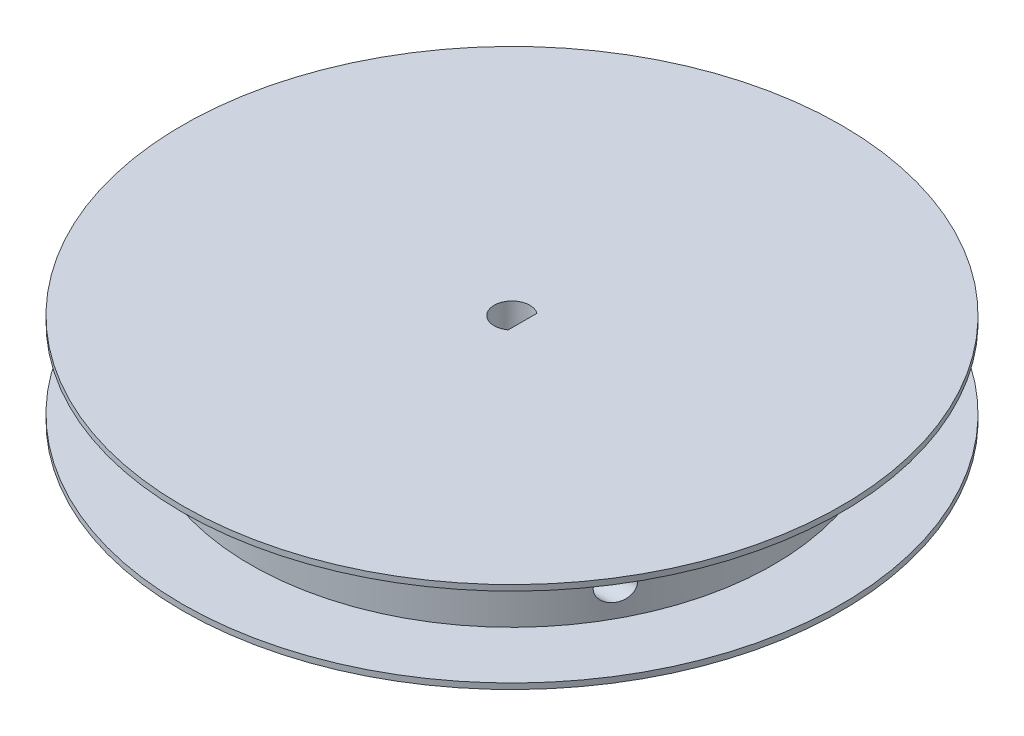
ISO-10303-21;
HEADER;
FILE_DESCRIPTION(('STEP AP214'),'2;1');
FILE_NAME('part.step','',(''),(''),'','','');
FILE_SCHEMA(('AUTOMOTIVE_DESIGN { 1 0 10303 214 1 1 1 1 }'));
ENDSEC;
DATA;
#1=APPLICATION_CONTEXT('core data for automotive mechanical design processes');
#2=APPLICATION_PROTOCOL_DEFINITION('international standard','automotive_design',2000,#1);
#3=PRODUCT_CONTEXT('',#1,'mechanical');
#4=PRODUCT('Part','Part','',(#3));
#5=PRODUCT_RELATED_PRODUCT_CATEGORY('part','',(#4));
#6=PRODUCT_DEFINITION_FORMATION('','',#4);
#7=PRODUCT_DEFINITION_CONTEXT('part definition',#1,'design');
#8=PRODUCT_DEFINITION('design','',#6,#7);
#9=PRODUCT_DEFINITION_SHAPE('','',#8);
#10=(LENGTH_UNIT() NAMED_UNIT(*) SI_UNIT(.MILLI.,.METRE.));
#11=(NAMED_UNIT(*) PLANE_ANGLE_UNIT() SI_UNIT($,.RADIAN.));
#12=(NAMED_UNIT(*) SI_UNIT($,.STERADIAN.) SOLID_ANGLE_UNIT());
#13=UNCERTAINTY_MEASURE_WITH_UNIT(LENGTH_MEASURE(1.E-05),#10,'distance_accuracy_value','');
#14=(GEOMETRIC_REPRESENTATION_CONTEXT(3) GLOBAL_UNCERTAINTY_ASSIGNED_CONTEXT((#13)) GLOBAL_UNIT_ASSIGNED_CONTEXT((#10,
#11,#12)) REPRESENTATION_CONTEXT('',''));
#15=CARTESIAN_POINT('',(0.,0.,0.));
#16=DIRECTION('',(0.,0.,1.));
#17=DIRECTION('',(1.,0.,0.));
#18=AXIS2_PLACEMENT_3D('',#15,#16,#17);
#19=CARTESIAN_POINT('',(0.,0.,0.));
#20=DIRECTION('',(0.,-1.,0.));
#21=DIRECTION('',(0.,0.,-1.));
#22=AXIS2_PLACEMENT_3D('',#19,#20,#21);
#23=CYLINDRICAL_SURFACE('',#22,23.);
#24=CARTESIAN_POINT('',(-20.8201277665788,-4.98760134399845,9.77355000925123));
#25=CARTESIAN_POINT('',(-20.8201267400689,-5.05328921218362,9.77355269440811));
#26=CARTESIAN_POINT('',(-20.8177072873382,-5.11900916263321,9.77871135535889));
#27=CARTESIAN_POINT('',(-20.8081066599204,-5.24853422398031,9.79912338930162));
#28=CARTESIAN_POINT('',(-20.8009215578614,-5.31233771015021,9.81438508818777));
#29=CARTESIAN_POINT('',(-20.7820462072199,-5.43607376462551,9.85429030868141));
#30=CARTESIAN_POINT('',(-20.7703653214766,-5.49601407742824,9.87891433119441));
#31=CARTESIAN_POINT('',(-20.7428608743051,-5.61066285216219,9.93653546990273));
#32=CARTESIAN_POINT('',(-20.727037405656,-5.66537143122823,9.96953239857416));
#33=CARTESIAN_POINT('',(-20.691075857807,-5.77020444373711,10.0439604326227));
#34=CARTESIAN_POINT('',(-20.670806961056,-5.82010353323316,10.0856447657695));
#35=CARTESIAN_POINT('',(-20.6268496625276,-5.91218896571839,10.1752426136738));
#36=CARTESIAN_POINT('',(-20.6031602205385,-5.95437295361405,10.2231580229028));
#37=CARTESIAN_POINT('',(-20.5506658867992,-6.03388388818919,10.3283047158286));
#38=CARTESIAN_POINT('',(-20.52159288954,-6.07043778380417,10.3859859821205));
#39=CARTESIAN_POINT('',(-20.4607576235509,-6.13338225985286,10.5053267202189));
#40=CARTESIAN_POINT('',(-20.4289941897235,-6.15976840939713,10.5669879127591));
#41=CARTESIAN_POINT('',(-20.3599903962203,-6.20452845800528,10.6993890838998));
#42=CARTESIAN_POINT('',(-20.3225261660952,-6.22175886866498,10.7703992577655));
#43=CARTESIAN_POINT('',(-20.2460397640869,-6.24375841948167,10.9134993395186));
#44=CARTESIAN_POINT('',(-20.2070169535579,-6.24852239707175,10.9855896822982));
#45=CARTESIAN_POINT('',(-20.1247250962086,-6.24565444294804,11.1356814442102));
#46=CARTESIAN_POINT('',(-20.0813914932744,-6.23686109082303,11.2136270695252));
#47=CARTESIAN_POINT('',(-19.9950876873888,-6.20496065912906,11.3668028753028));
#48=CARTESIAN_POINT('',(-19.9521177256557,-6.1818447340537,11.4420313472649));
#49=CARTESIAN_POINT('',(-19.8665341245799,-6.12063328970248,11.5900109354408));
#50=CARTESIAN_POINT('',(-19.8239747139013,-6.0820872304539,11.662608503972));
#51=CARTESIAN_POINT('',(-19.7423744709691,-5.99047026825072,11.8002134107429));
#52=CARTESIAN_POINT('',(-19.7033297089548,-5.93741586222082,11.8652292508431));
#53=CARTESIAN_POINT('',(-19.6387129089711,-5.83063358399123,11.9717987607318));
#54=CARTESIAN_POINT('',(-19.6120594250459,-5.779574184091,12.0153773094841));
#55=CARTESIAN_POINT('',(-19.5632844313971,-5.66970305555947,12.094629611591));
#56=CARTESIAN_POINT('',(-19.5411605284595,-5.610895447846,12.1303075400725));
#57=CARTESIAN_POINT('',(-19.5025309991407,-5.48625979543512,12.1923188001952));
#58=CARTESIAN_POINT('',(-19.48606438857,-5.42038695338582,12.2185872900309));
#59=CARTESIAN_POINT('',(-19.460138165894,-5.2838896706092,12.2598380408782));
#60=CARTESIAN_POINT('',(-19.4506727922263,-5.21326918921244,12.2748295822578));
#61=CARTESIAN_POINT('',(-19.4401949951983,-5.07865009153111,12.2914156617952));
#62=CARTESIAN_POINT('',(-19.4382943496703,-5.01489101173985,12.2944180837121));
#63=CARTESIAN_POINT('',(-19.4406119502735,-4.88777579606356,12.2907531575771));
#64=CARTESIAN_POINT('',(-19.4448281927299,-4.82441953505639,12.2840889759608));
#65=CARTESIAN_POINT('',(-19.458694418242,-4.70350942743787,12.2621109286092));
#66=CARTESIAN_POINT('',(-19.4680336272977,-4.64582793661162,12.247291624817));
#67=CARTESIAN_POINT('',(-19.4913930540478,-4.53397904493975,12.2100809377849));
#68=CARTESIAN_POINT('',(-19.5054140065392,-4.47981219731026,12.1876883659176));
#69=CARTESIAN_POINT('',(-19.5384236708607,-4.37296117317289,12.1347034190032));
#70=CARTESIAN_POINT('',(-19.5576582997464,-4.32055691502562,12.1037024761793));
#71=CARTESIAN_POINT('',(-19.5997880562224,-4.22170986421361,12.035361194132));
#72=CARTESIAN_POINT('',(-19.6226847925312,-4.17526970774501,11.9980180684179));
#73=CARTESIAN_POINT('',(-19.6745416218283,-4.08317980812586,11.912816971982));
#74=CARTESIAN_POINT('',(-19.7039031159814,-4.03843906271518,11.864221939886));
#75=CARTESIAN_POINT('',(-19.7652499030421,-3.95768561395183,11.7617375108293));
#76=CARTESIAN_POINT('',(-19.7972366251352,-3.92167770754775,11.707845226824));
#77=CARTESIAN_POINT('',(-19.8677115944034,-3.85407285703309,11.5879047669792));
#78=CARTESIAN_POINT('',(-19.9064702174051,-3.82387162853427,11.5212268524579));
#79=CARTESIAN_POINT('',(-19.9851165584924,-3.77550739333209,11.3842594884077));
#80=CARTESIAN_POINT('',(-20.0250048590958,-3.75735071974017,11.3139681598157));
#81=CARTESIAN_POINT('',(-20.1088059569422,-3.73215078617892,11.1644056707805));
#82=CARTESIAN_POINT('',(-20.1527320638943,-3.72636325854476,11.0849270458703));
#83=CARTESIAN_POINT('',(-20.2395075501056,-3.72990510680774,10.925683553727));
#84=CARTESIAN_POINT('',(-20.2823566640972,-3.73923817062283,10.8459186213981));
#85=CARTESIAN_POINT('',(-20.3661340263243,-3.77341967969418,10.6877806683589));
#86=CARTESIAN_POINT('',(-20.4070426646146,-3.79840041252969,10.6094254357774));
#87=CARTESIAN_POINT('',(-20.4852622063449,-3.86403357945955,10.4575962413583));
#88=CARTESIAN_POINT('',(-20.5225746060667,-3.90467946028357,10.3841202534126));
#89=CARTESIAN_POINT('',(-20.5896112388732,-3.99747554616025,10.2505158653664));
#90=CARTESIAN_POINT('',(-20.6196974234072,-4.04850951140107,10.1897965786492));
#91=CARTESIAN_POINT('',(-20.6745904664933,-4.16257559992489,10.0779558291294));
#92=CARTESIAN_POINT('',(-20.6994009681721,-4.2255993862733,10.0268277460066));
#93=CARTESIAN_POINT('',(-20.7402335468622,-4.35402369954427,9.94206607720204));
#94=CARTESIAN_POINT('',(-20.7569356645602,-4.41833101838886,9.90710146572944));
#95=CARTESIAN_POINT('',(-20.7847494093795,-4.5530143041613,9.84861672640362));
#96=CARTESIAN_POINT('',(-20.7958706122539,-4.62337963194415,9.8250769979918));
#97=CARTESIAN_POINT('',(-20.8093323547087,-4.74314940688926,9.79652169523021));
#98=CARTESIAN_POINT('',(-20.8133728144627,-4.791543986184,9.78792888269836));
#99=CARTESIAN_POINT('',(-20.8187707618184,-4.88915354306745,9.77644233776328));
#100=CARTESIAN_POINT('',(-20.8201285359457,-4.93836843247624,9.77354799673211));
#101=CARTESIAN_POINT('',(-20.8201277665788,-4.98760134399845,9.77355000925123));
#102=B_SPLINE_CURVE_WITH_KNOTS('',3,(#24,#25,#26,#27,#28,#29,#30,#31,#32,#33,#34,#35,#36,#37,
#38,#39,#40,#41,#42,#43,#44,#45,#46,#47,#48,#49,#50,#51,#52,#53,#54,#55,#56,#57,#58,#59,#60,#61,
#62,#63,#64,#65,#66,#67,#68,#69,#70,#71,#72,#73,#74,#75,#76,#77,#78,#79,#80,#81,#82,#83,#84,#85,
#86,#87,#88,#89,#90,#91,#92,#93,#94,#95,#96,#97,#98,#99,#100,#101),.UNSPECIFIED.,.T.,.F.,(4,2,2,
2,2,2,2,2,2,2,2,2,2,2,2,2,2,2,2,2,2,2,2,2,2,2,2,2,2,2,2,2,2,2,2,2,2,2,4),(0.,0.196876778612762,
0.393916005316138,0.590547082804578,0.787173756831328,0.990632758969205,1.19415376523176,
1.41589714377441,1.63773704442347,1.88305470803927,2.12847394590394,2.39611422115121,
2.66391995387426,2.94019364581868,3.21615449369814,3.43195240973539,3.64763601255944,
3.86477855692607,4.08174220768487,4.27231236434436,4.46282011109236,4.64287693548719,
4.82296203299418,5.0137607229395,5.20464345977375,5.42065667022378,5.63678826934365,
5.88424526795129,6.13183227826827,6.4035518011501,6.67533760650369,6.94945272641147,
7.22345329878588,7.47651928301109,7.72940994069358,7.95342273551865,8.17704984286561,
8.32462431441878,8.47218302335565),.UNSPECIFIED.);
#103=CARTESIAN_POINT('',(-20.8201277665788,-4.98760134399845,9.77355000925123));
#104=VERTEX_POINT('',#103);
#105=EDGE_CURVE('E46',#104,#104,#102,.T.);
#106=ORIENTED_EDGE('',*,*,#105,.F.);
#107=EDGE_LOOP('',(#106));
#108=FACE_BOUND('',#107,.T.);
#109=CARTESIAN_POINT('',(20.8201277665788,-4.98760134399845,9.77355000925123));
#110=CARTESIAN_POINT('',(20.8201267400689,-4.92191347581328,9.77355269440811));
#111=CARTESIAN_POINT('',(20.8177072873382,-4.85619352536369,9.77871135535889));
#112=CARTESIAN_POINT('',(20.8081066599204,-4.72666846401659,9.79912338930162));
#113=CARTESIAN_POINT('',(20.8009215578614,-4.66286497784669,9.81438508818777));
#114=CARTESIAN_POINT('',(20.7820462072199,-4.53912892337139,9.85429030868141));
#115=CARTESIAN_POINT('',(20.7703653214766,-4.47918861056866,9.87891433119441));
#116=CARTESIAN_POINT('',(20.7428608743051,-4.36453983583471,9.93653546990273));
#117=CARTESIAN_POINT('',(20.727037405656,-4.30983125676867,9.96953239857416));
#118=CARTESIAN_POINT('',(20.691075857807,-4.20499824425979,10.0439604326227));
#119=CARTESIAN_POINT('',(20.670806961056,-4.15509915476373,10.0856447657695));
#120=CARTESIAN_POINT('',(20.6268496625276,-4.06301372227851,10.1752426136738));
#121=CARTESIAN_POINT('',(20.6031602205385,-4.02082973438285,10.2231580229028));
#122=CARTESIAN_POINT('',(20.5506658867992,-3.94131879980771,10.3283047158286));
#123=CARTESIAN_POINT('',(20.52159288954,-3.90476490419273,10.3859859821205));
#124=CARTESIAN_POINT('',(20.4607576235509,-3.84182042814404,10.5053267202189));
#125=CARTESIAN_POINT('',(20.4289941897235,-3.81543427859977,10.5669879127591));
#126=CARTESIAN_POINT('',(20.3599903962203,-3.77067422999162,10.6993890838998));
#127=CARTESIAN_POINT('',(20.3225261660952,-3.75344381933192,10.7703992577655));
#128=CARTESIAN_POINT('',(20.2460397640869,-3.73144426851523,10.9134993395186));
#129=CARTESIAN_POINT('',(20.2070169535579,-3.72668029092514,10.9855896822982));
#130=CARTESIAN_POINT('',(20.1247250962086,-3.72954824504886,11.1356814442102));
#131=CARTESIAN_POINT('',(20.0813914932744,-3.73834159717387,11.2136270695252));
#132=CARTESIAN_POINT('',(19.9950876873888,-3.77024202886784,11.3668028753028));
#133=CARTESIAN_POINT('',(19.9521177256557,-3.7933579539432,11.4420313472649));
#134=CARTESIAN_POINT('',(19.8665341245799,-3.85456939829442,11.5900109354408));
#135=CARTESIAN_POINT('',(19.8239747139013,-3.893115457543,11.662608503972));
#136=CARTESIAN_POINT('',(19.7423744709691,-3.98473241974617,11.8002134107429));
#137=CARTESIAN_POINT('',(19.7033297089548,-4.03778682577607,11.8652292508431));
#138=CARTESIAN_POINT('',(19.6387129089711,-4.14456910400567,11.9717987607318));
#139=CARTESIAN_POINT('',(19.6120594250459,-4.1956285039059,12.0153773094841));
#140=CARTESIAN_POINT('',(19.5632844313971,-4.30549963243742,12.094629611591));
#141=CARTESIAN_POINT('',(19.5411605284595,-4.3643072401509,12.1303075400725));
#142=CARTESIAN_POINT('',(19.5025309991407,-4.48894289256178,12.1923188001952));
#143=CARTESIAN_POINT('',(19.48606438857,-4.55481573461108,12.2185872900309));
#144=CARTESIAN_POINT('',(19.460138165894,-4.69131301738769,12.2598380408782));
#145=CARTESIAN_POINT('',(19.4506727922263,-4.76193349878446,12.2748295822578));
#146=CARTESIAN_POINT('',(19.4401949951983,-4.89655259646579,12.2914156617952));
#147=CARTESIAN_POINT('',(19.4382943496703,-4.96031167625705,12.2944180837121));
#148=CARTESIAN_POINT('',(19.4406119502735,-5.08742689193334,12.2907531575771));
#149=CARTESIAN_POINT('',(19.4448281927299,-5.15078315294051,12.2840889759608));
#150=CARTESIAN_POINT('',(19.458694418242,-5.27169326055902,12.2621109286092));
#151=CARTESIAN_POINT('',(19.4680336272977,-5.32937475138528,12.247291624817));
#152=CARTESIAN_POINT('',(19.4913930540478,-5.44122364305715,12.2100809377849));
#153=CARTESIAN_POINT('',(19.5054140065392,-5.49539049068663,12.1876883659176));
#154=CARTESIAN_POINT('',(19.5384236708607,-5.60224151482401,12.1347034190032));
#155=CARTESIAN_POINT('',(19.5576582997464,-5.65464577297128,12.1037024761793));
#156=CARTESIAN_POINT('',(19.5997880562224,-5.75349282378329,12.035361194132));
#157=CARTESIAN_POINT('',(19.6226847925312,-5.79993298025188,11.9980180684179));
#158=CARTESIAN_POINT('',(19.6745416218283,-5.89202287987104,11.912816971982));
#159=CARTESIAN_POINT('',(19.7039031159814,-5.93676362528172,11.864221939886));
#160=CARTESIAN_POINT('',(19.7652499030421,-6.01751707404507,11.7617375108293));
#161=CARTESIAN_POINT('',(19.7972366251352,-6.05352498044915,11.707845226824));
#162=CARTESIAN_POINT('',(19.8677115944034,-6.12112983096381,11.5879047669792));
#163=CARTESIAN_POINT('',(19.9064702174051,-6.15133105946263,11.5212268524579));
#164=CARTESIAN_POINT('',(19.9851165584924,-6.19969529466481,11.3842594884077));
#165=CARTESIAN_POINT('',(20.0250048590958,-6.21785196825672,11.3139681598157));
#166=CARTESIAN_POINT('',(20.1088059569422,-6.24305190181798,11.1644056707805));
#167=CARTESIAN_POINT('',(20.1527320638943,-6.24883942945213,11.0849270458703));
#168=CARTESIAN_POINT('',(20.2395075501056,-6.24529758118916,10.925683553727));
#169=CARTESIAN_POINT('',(20.2823566640972,-6.23596451737407,10.8459186213981));
#170=CARTESIAN_POINT('',(20.3661340263243,-6.20178300830271,10.6877806683589));
#171=CARTESIAN_POINT('',(20.4070426646146,-6.1768022754672,10.6094254357774));
#172=CARTESIAN_POINT('',(20.4852622063449,-6.11116910853735,10.4575962413583));
#173=CARTESIAN_POINT('',(20.5225746060667,-6.07052322771333,10.3841202534126));
#174=CARTESIAN_POINT('',(20.5896112388732,-5.97772714183664,10.2505158653664));
#175=CARTESIAN_POINT('',(20.6196974234072,-5.92669317659583,10.1897965786492));
#176=CARTESIAN_POINT('',(20.6745904664933,-5.81262708807201,10.0779558291294));
#177=CARTESIAN_POINT('',(20.6994009681721,-5.74960330172359,10.0268277460066));
#178=CARTESIAN_POINT('',(20.7402335468622,-5.62117898845263,9.94206607720204));
#179=CARTESIAN_POINT('',(20.7569356645602,-5.55687166960804,9.90710146572944));
#180=CARTESIAN_POINT('',(20.7847494093795,-5.4221883838356,9.84861672640362));
#181=CARTESIAN_POINT('',(20.7958706122539,-5.35182305605274,9.8250769979918));
#182=CARTESIAN_POINT('',(20.8093323547087,-5.23205328110764,9.79652169523021));
#183=CARTESIAN_POINT('',(20.8133728144627,-5.1836587018129,9.78792888269836));
#184=CARTESIAN_POINT('',(20.8187707618184,-5.08604914492945,9.77644233776328));
#185=CARTESIAN_POINT('',(20.8201285359457,-5.03683425552065,9.77354799673211));
#186=CARTESIAN_POINT('',(20.8201277665788,-4.98760134399845,9.77355000925123));
#187=B_SPLINE_CURVE_WITH_KNOTS('',3,(#109,#110,#111,#112,#113,#114,#115,#116,#117,#118,#119,
#120,#121,#122,#123,#124,#125,#126,#127,#128,#129,#130,#131,#132,#133,#134,#135,#136,#137,#138,
#139,#140,#141,#142,#143,#144,#145,#146,#147,#148,#149,#150,#151,#152,#153,#154,#155,#156,#157,
#158,#159,#160,#161,#162,#163,#164,#165,#166,#167,#168,#169,#170,#171,#172,#173,#174,#175,#176,
#177,#178,#179,#180,#181,#182,#183,#184,#185,#186),.UNSPECIFIED.,.T.,.F.,(4,2,2,2,2,2,2,2,2,2,2,
2,2,2,2,2,2,2,2,2,2,2,2,2,2,2,2,2,2,2,2,2,2,2,2,2,2,2,4),(0.,0.196876778612762,
0.393916005316138,0.590547082804579,0.787173756831328,0.990632758969206,1.19415376523176,
1.41589714377441,1.63773704442347,1.88305470803927,2.12847394590394,2.39611422115121,
2.66391995387426,2.94019364581868,3.21615449369814,3.43195240973539,3.64763601255944,
3.86477855692607,4.08174220768487,4.27231236434437,4.46282011109236,4.64287693548719,
4.82296203299419,5.0137607229395,5.20464345977376,5.42065667022378,5.63678826934365,
5.88424526795129,6.13183227826827,6.4035518011501,6.67533760650369,6.94945272641147,
7.22345329878589,7.47651928301109,7.72940994069358,7.95342273551865,8.17704984286561,
8.32462431441878,8.47218302335565),.UNSPECIFIED.);
#188=CARTESIAN_POINT('',(20.8201277665788,-4.98760134399845,9.77355000925123));
#189=VERTEX_POINT('',#188);
#190=EDGE_CURVE('E94',#189,#189,#187,.T.);
#191=ORIENTED_EDGE('',*,*,#190,.F.);
#192=EDGE_LOOP('',(#191));
#193=FACE_BOUND('',#192,.T.);
#194=CARTESIAN_POINT('',(0.,-0.5,0.));
#195=DIRECTION('',(0.,1.,0.));
#196=DIRECTION('',(0.,0.,1.));
#197=AXIS2_PLACEMENT_3D('',#194,#195,#196);
#198=CIRCLE('',#197,23.);
#199=CARTESIAN_POINT('',(0.,-0.5,23.));
#200=VERTEX_POINT('',#199);
#201=EDGE_CURVE('E139',#200,#200,#198,.T.);
#202=ORIENTED_EDGE('',*,*,#201,.F.);
#203=EDGE_LOOP('',(#202));
#204=FACE_BOUND('',#203,.T.);
#205=CARTESIAN_POINT('',(0.,-7.5,0.));
#206=DIRECTION('',(0.,-1.,0.));
#207=DIRECTION('',(0.,0.,-1.));
#208=AXIS2_PLACEMENT_3D('',#205,#206,#207);
#209=CIRCLE('',#208,23.);
#210=CARTESIAN_POINT('',(0.,-7.5,-23.));
#211=VERTEX_POINT('',#210);
#212=EDGE_CURVE('E142',#211,#211,#209,.T.);
#213=ORIENTED_EDGE('',*,*,#212,.F.);
#214=EDGE_LOOP('',(#213));
#215=FACE_BOUND('',#214,.T.);
#216=ADVANCED_FACE('F42',(#108,#193,#204,#215),#23,.T.);
#217=CARTESIAN_POINT('',(0.,-8.,0.));
#218=DIRECTION('',(0.,1.,0.));
#219=DIRECTION('',(0.,0.,1.));
#220=AXIS2_PLACEMENT_3D('',#217,#218,#219);
#221=PLANE('',#220);
#222=DIRECTION('',(0.,0.,-1.));
#223=VECTOR('',#222,1.);
#224=CARTESIAN_POINT('',(0.93,-8.,0.));
#225=LINE('',#224,#223);
#226=CARTESIAN_POINT('',(0.93,-8.,1.26491106406735));
#227=VERTEX_POINT('',#226);
#228=CARTESIAN_POINT('',(0.93,-8.,-1.26491106406735));
#229=VERTEX_POINT('',#228);
#230=EDGE_CURVE('E63',#227,#229,#225,.T.);
#231=ORIENTED_EDGE('',*,*,#230,.T.);
#232=CARTESIAN_POINT('',(0.,-8.,0.));
#233=DIRECTION('',(0.,-1.,0.));
#234=DIRECTION('',(0.,0.,-1.));
#235=AXIS2_PLACEMENT_3D('',#232,#233,#234);
#236=CIRCLE('',#235,1.57);
#237=EDGE_CURVE('E79',#227,#229,#236,.T.);
#238=ORIENTED_EDGE('',*,*,#237,.F.);
#239=EDGE_LOOP('',(#231,#238));
#240=FACE_BOUND('',#239,.T.);
#241=CARTESIAN_POINT('',(0.,-8.,0.));
#242=DIRECTION('',(0.,-1.,0.));
#243=DIRECTION('',(0.,0.,-1.));
#244=AXIS2_PLACEMENT_3D('',#241,#242,#243);
#245=CIRCLE('',#244,29.);
#246=CARTESIAN_POINT('',(0.,-8.,-29.));
#247=VERTEX_POINT('',#246);
#248=EDGE_CURVE('E143',#247,#247,#245,.T.);
#249=ORIENTED_EDGE('',*,*,#248,.T.);
#250=EDGE_LOOP('',(#249));
#251=FACE_BOUND('',#250,.T.);
#252=ADVANCED_FACE('F83',(#240,#251),#221,.F.);
#253=CARTESIAN_POINT('',(0.,0.,0.));
#254=DIRECTION('',(0.,1.,0.));
#255=DIRECTION('',(0.,0.,1.));
#256=AXIS2_PLACEMENT_3D('',#253,#254,#255);
#257=PLANE('',#256);
#258=CARTESIAN_POINT('',(0.,0.,0.));
#259=DIRECTION('',(0.,-1.,0.));
#260=DIRECTION('',(0.,0.,-1.));
#261=AXIS2_PLACEMENT_3D('',#258,#259,#260);
#262=CIRCLE('',#261,1.57);
#263=CARTESIAN_POINT('',(0.93,0.,1.26491106406735));
#264=VERTEX_POINT('',#263);
#265=CARTESIAN_POINT('',(0.93,0.,-1.26491106406735));
#266=VERTEX_POINT('',#265);
#267=EDGE_CURVE('E91',#264,#266,#262,.T.);
#268=ORIENTED_EDGE('',*,*,#267,.T.);
#269=DIRECTION('',(0.,0.,-1.));
#270=VECTOR('',#269,1.);
#271=CARTESIAN_POINT('',(0.93,0.,0.));
#272=LINE('',#271,#270);
#273=EDGE_CURVE('E76',#264,#266,#272,.T.);
#274=ORIENTED_EDGE('',*,*,#273,.F.);
#275=EDGE_LOOP('',(#268,#274));
#276=FACE_BOUND('',#275,.T.);
#277=CARTESIAN_POINT('',(0.,0.,0.));
#278=DIRECTION('',(0.,1.,0.));
#279=DIRECTION('',(0.,0.,1.));
#280=AXIS2_PLACEMENT_3D('',#277,#278,#279);
#281=CIRCLE('',#280,29.);
#282=CARTESIAN_POINT('',(0.,0.,29.));
#283=VERTEX_POINT('',#282);
#284=EDGE_CURVE('E88',#283,#283,#281,.T.);
#285=ORIENTED_EDGE('',*,*,#284,.T.);
#286=EDGE_LOOP('',(#285));
#287=FACE_BOUND('',#286,.T.);
#288=ADVANCED_FACE('F44',(#276,#287),#257,.T.);
#289=CARTESIAN_POINT('',(0.93,0.,0.));
#290=DIRECTION('',(-1.,0.,0.));
#291=DIRECTION('',(0.,0.,1.));
#292=AXIS2_PLACEMENT_3D('',#289,#290,#291);
#293=PLANE('',#292);
#294=ORIENTED_EDGE('',*,*,#230,.F.);
#295=DIRECTION('',(0.,-1.,0.));
#296=VECTOR('',#295,1.);
#297=CARTESIAN_POINT('',(0.93,0.,1.26491106406735));
#298=LINE('',#297,#296);
#299=EDGE_CURVE('E56',#264,#227,#298,.T.);
#300=ORIENTED_EDGE('',*,*,#299,.F.);
#301=ORIENTED_EDGE('',*,*,#273,.T.);
#302=DIRECTION('',(0.,-1.,0.));
#303=VECTOR('',#302,1.);
#304=CARTESIAN_POINT('',(0.93,0.,-1.26491106406735));
#305=LINE('',#304,#303);
#306=EDGE_CURVE('E11',#266,#229,#305,.T.);
#307=ORIENTED_EDGE('',*,*,#306,.T.);
#308=EDGE_LOOP('',(#294,#300,#301,#307));
#309=FACE_BOUND('',#308,.T.);
#310=ADVANCED_FACE('F74',(#309),#293,.T.);
#311=CARTESIAN_POINT('',(0.,0.,0.));
#312=DIRECTION('',(0.,-1.,0.));
#313=DIRECTION('',(0.,0.,-1.));
#314=AXIS2_PLACEMENT_3D('',#311,#312,#313);
#315=CYLINDRICAL_SURFACE('',#314,1.57);
#316=ORIENTED_EDGE('',*,*,#237,.T.);
#317=ORIENTED_EDGE('',*,*,#306,.F.);
#318=ORIENTED_EDGE('',*,*,#267,.F.);
#319=ORIENTED_EDGE('',*,*,#299,.T.);
#320=EDGE_LOOP('',(#316,#317,#318,#319));
#321=FACE_BOUND('',#320,.T.);
#322=ADVANCED_FACE('F80',(#321),#315,.F.);
#323=CARTESIAN_POINT('',(0.,-0.5,0.));
#324=DIRECTION('',(0.,1.,0.));
#325=DIRECTION('',(0.,0.,1.));
#326=AXIS2_PLACEMENT_3D('',#323,#324,#325);
#327=CYLINDRICAL_SURFACE('',#326,29.);
#328=CARTESIAN_POINT('',(0.,-0.5,0.));
#329=DIRECTION('',(0.,1.,0.));
#330=DIRECTION('',(0.,0.,1.));
#331=AXIS2_PLACEMENT_3D('',#328,#329,#330);
#332=CIRCLE('',#331,29.);
#333=CARTESIAN_POINT('',(0.,-0.5,29.));
#334=VERTEX_POINT('',#333);
#335=EDGE_CURVE('E85',#334,#334,#332,.T.);
#336=ORIENTED_EDGE('',*,*,#335,.T.);
#337=EDGE_LOOP('',(#336));
#338=FACE_BOUND('',#337,.T.);
#339=ORIENTED_EDGE('',*,*,#284,.F.);
#340=EDGE_LOOP('',(#339));
#341=FACE_BOUND('',#340,.T.);
#342=ADVANCED_FACE('F118',(#338,#341),#327,.T.);
#343=CARTESIAN_POINT('',(0.,-0.5,0.));
#344=DIRECTION('',(0.,1.,0.));
#345=DIRECTION('',(0.,0.,1.));
#346=AXIS2_PLACEMENT_3D('',#343,#344,#345);
#347=PLANE('',#346);
#348=ORIENTED_EDGE('',*,*,#201,.T.);
#349=EDGE_LOOP('',(#348));
#350=FACE_BOUND('',#349,.T.);
#351=ORIENTED_EDGE('',*,*,#335,.F.);
#352=EDGE_LOOP('',(#351));
#353=FACE_BOUND('',#352,.T.);
#354=ADVANCED_FACE('F115',(#350,#353),#347,.F.);
#355=CARTESIAN_POINT('',(0.,-7.5,0.));
#356=DIRECTION('',(0.,-1.,0.));
#357=DIRECTION('',(0.,0.,-1.));
#358=AXIS2_PLACEMENT_3D('',#355,#356,#357);
#359=CYLINDRICAL_SURFACE('',#358,29.);
#360=CARTESIAN_POINT('',(0.,-7.5,0.));
#361=DIRECTION('',(0.,-1.,0.));
#362=DIRECTION('',(0.,0.,-1.));
#363=AXIS2_PLACEMENT_3D('',#360,#361,#362);
#364=CIRCLE('',#363,29.);
#365=CARTESIAN_POINT('',(0.,-7.5,-29.));
#366=VERTEX_POINT('',#365);
#367=EDGE_CURVE('E146',#366,#366,#364,.T.);
#368=ORIENTED_EDGE('',*,*,#367,.T.);
#369=EDGE_LOOP('',(#368));
#370=FACE_BOUND('',#369,.T.);
#371=ORIENTED_EDGE('',*,*,#248,.F.);
#372=EDGE_LOOP('',(#371));
#373=FACE_BOUND('',#372,.T.);
#374=ADVANCED_FACE('F111',(#370,#373),#359,.T.);
#375=CARTESIAN_POINT('',(0.,-7.5,0.));
#376=DIRECTION('',(0.,-1.,0.));
#377=DIRECTION('',(0.,0.,-1.));
#378=AXIS2_PLACEMENT_3D('',#375,#376,#377);
#379=PLANE('',#378);
#380=ORIENTED_EDGE('',*,*,#212,.T.);
#381=EDGE_LOOP('',(#380));
#382=FACE_BOUND('',#381,.T.);
#383=ORIENTED_EDGE('',*,*,#367,.F.);
#384=EDGE_LOOP('',(#383));
#385=FACE_BOUND('',#384,.T.);
#386=ADVANCED_FACE('F106',(#382,#385),#379,.F.);
#387=CARTESIAN_POINT('',(-25.,-4.98760134399845,11.0333288995434));
#388=DIRECTION('',(1.,0.,0.));
#389=DIRECTION('',(0.,0.,-1.));
#390=AXIS2_PLACEMENT_3D('',#387,#388,#389);
#391=CYLINDRICAL_SURFACE('',#390,1.25977889029222);
#392=ORIENTED_EDGE('',*,*,#105,.T.);
#393=EDGE_LOOP('',(#392));
#394=FACE_BOUND('',#393,.T.);
#395=ORIENTED_EDGE('',*,*,#190,.T.);
#396=EDGE_LOOP('',(#395));
#397=FACE_BOUND('',#396,.T.);
#398=ADVANCED_FACE('F102',(#394,#397),#391,.F.);
#399=CLOSED_SHELL('',(#216,#252,#288,#310,#322,#342,#354,#374,#386,#398));
#400=MANIFOLD_SOLID_BREP('B2',#399);
#401=ADVANCED_BREP_SHAPE_REPRESENTATION('',(#18,#400),#14);
#402=SHAPE_DEFINITION_REPRESENTATION(#9,#401);
ENDSEC;
END-ISO-10303-21;
